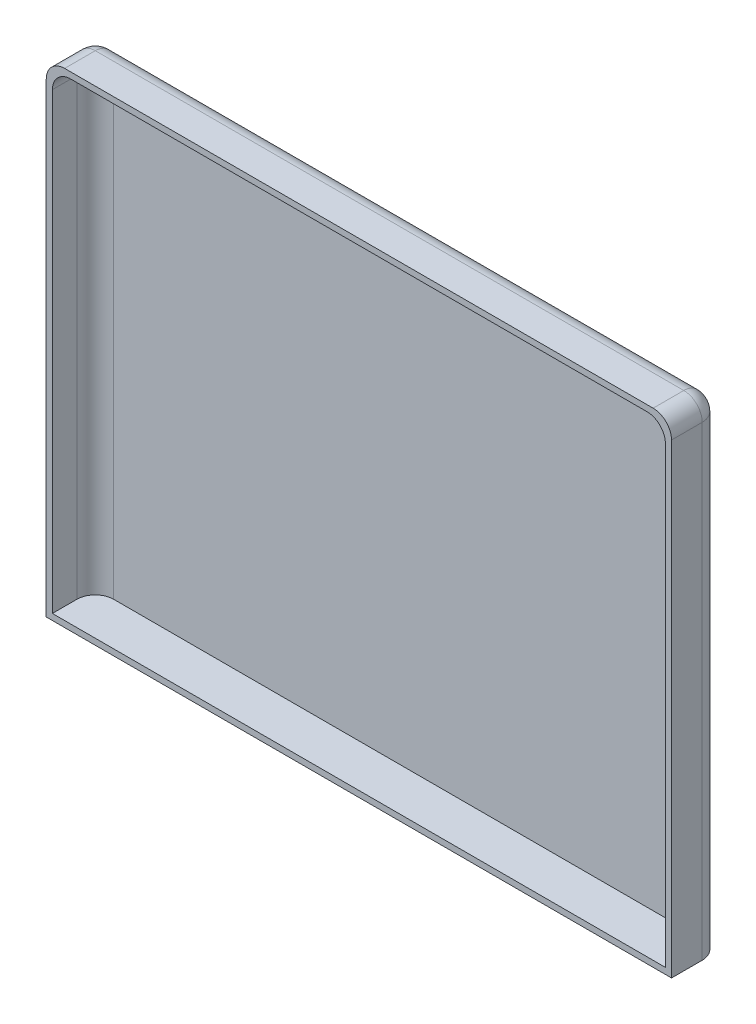
ISO-10303-21;
HEADER;
FILE_DESCRIPTION(('STEP AP214'),'2;1');
FILE_NAME('part.step','',(''),(''),'','','');
FILE_SCHEMA(('AUTOMOTIVE_DESIGN { 1 0 10303 214 1 1 1 1 }'));
ENDSEC;
DATA;
#1=APPLICATION_CONTEXT('core data for automotive mechanical design processes');
#2=APPLICATION_PROTOCOL_DEFINITION('international standard','automotive_design',2000,#1);
#3=PRODUCT_CONTEXT('',#1,'mechanical');
#4=PRODUCT('Part','Part','',(#3));
#5=PRODUCT_RELATED_PRODUCT_CATEGORY('part','',(#4));
#6=PRODUCT_DEFINITION_FORMATION('','',#4);
#7=PRODUCT_DEFINITION_CONTEXT('part definition',#1,'design');
#8=PRODUCT_DEFINITION('design','',#6,#7);
#9=PRODUCT_DEFINITION_SHAPE('','',#8);
#10=(LENGTH_UNIT() NAMED_UNIT(*) SI_UNIT(.MILLI.,.METRE.));
#11=(NAMED_UNIT(*) PLANE_ANGLE_UNIT() SI_UNIT($,.RADIAN.));
#12=(NAMED_UNIT(*) SI_UNIT($,.STERADIAN.) SOLID_ANGLE_UNIT());
#13=UNCERTAINTY_MEASURE_WITH_UNIT(LENGTH_MEASURE(1.E-05),#10,'distance_accuracy_value','');
#14=(GEOMETRIC_REPRESENTATION_CONTEXT(3) GLOBAL_UNCERTAINTY_ASSIGNED_CONTEXT((#13)) GLOBAL_UNIT_ASSIGNED_CONTEXT((#10,
#11,#12)) REPRESENTATION_CONTEXT('',''));
#15=CARTESIAN_POINT('',(0.,0.,0.));
#16=DIRECTION('',(0.,0.,1.));
#17=DIRECTION('',(1.,0.,0.));
#18=AXIS2_PLACEMENT_3D('',#15,#16,#17);
#19=CARTESIAN_POINT('',(0.,0.,-3.));
#20=DIRECTION('',(0.,0.,-1.));
#21=DIRECTION('',(-1.,0.,0.));
#22=AXIS2_PLACEMENT_3D('',#19,#20,#21);
#23=PLANE('',#22);
#24=DIRECTION('',(-1.,0.,0.));
#25=VECTOR('',#24,1.);
#26=CARTESIAN_POINT('',(-4.99999999999999,-5.,-3.));
#27=LINE('',#26,#25);
#28=CARTESIAN_POINT('',(95.,-5.,-3.));
#29=VERTEX_POINT('',#28);
#30=CARTESIAN_POINT('',(-4.99999999999999,-5.,-3.));
#31=VERTEX_POINT('',#30);
#32=EDGE_CURVE('E266',#29,#31,#27,.T.);
#33=ORIENTED_EDGE('',*,*,#32,.T.);
#34=DIRECTION('',(0.,1.,0.));
#35=VECTOR('',#34,1.);
#36=CARTESIAN_POINT('',(-5.,72.,-3.));
#37=LINE('',#36,#35);
#38=CARTESIAN_POINT('',(-5.,69.,-3.));
#39=VERTEX_POINT('',#38);
#40=EDGE_CURVE('E263',#31,#39,#37,.T.);
#41=ORIENTED_EDGE('',*,*,#40,.T.);
#42=CARTESIAN_POINT('',(-2.,69.,-3.));
#43=DIRECTION('',(0.,0.,-1.));
#44=DIRECTION('',(-1.,0.,0.));
#45=AXIS2_PLACEMENT_3D('',#42,#43,#44);
#46=CIRCLE('',#45,3.);
#47=CARTESIAN_POINT('',(-2.,72.,-3.));
#48=VERTEX_POINT('',#47);
#49=EDGE_CURVE('E243',#48,#39,#46,.F.);
#50=ORIENTED_EDGE('',*,*,#49,.F.);
#51=DIRECTION('',(1.,0.,0.));
#52=VECTOR('',#51,1.);
#53=CARTESIAN_POINT('',(-5.,72.,-3.));
#54=LINE('',#53,#52);
#55=CARTESIAN_POINT('',(92.,72.,-3.));
#56=VERTEX_POINT('',#55);
#57=EDGE_CURVE('E267',#48,#56,#54,.T.);
#58=ORIENTED_EDGE('',*,*,#57,.T.);
#59=CARTESIAN_POINT('',(92.,69.,-3.));
#60=DIRECTION('',(0.,0.,-1.));
#61=DIRECTION('',(-1.,0.,0.));
#62=AXIS2_PLACEMENT_3D('',#59,#60,#61);
#63=CIRCLE('',#62,3.);
#64=CARTESIAN_POINT('',(95.,69.,-3.));
#65=VERTEX_POINT('',#64);
#66=EDGE_CURVE('E262',#65,#56,#63,.F.);
#67=ORIENTED_EDGE('',*,*,#66,.F.);
#68=DIRECTION('',(0.,-1.,0.));
#69=VECTOR('',#68,1.);
#70=CARTESIAN_POINT('',(95.,72.,-3.));
#71=LINE('',#70,#69);
#72=EDGE_CURVE('E273',#65,#29,#71,.T.);
#73=ORIENTED_EDGE('',*,*,#72,.T.);
#74=EDGE_LOOP('',(#33,#41,#50,#58,#67,#73));
#75=FACE_BOUND('',#74,.T.);
#76=DIRECTION('',(0.,-1.,0.));
#77=VECTOR('',#76,1.);
#78=CARTESIAN_POINT('',(96.,72.,-3.));
#79=LINE('',#78,#77);
#80=CARTESIAN_POINT('',(96.,70.,-3.));
#81=VERTEX_POINT('',#80);
#82=CARTESIAN_POINT('',(96.,-6.00000000000001,-3.));
#83=VERTEX_POINT('',#82);
#84=EDGE_CURVE('E272',#81,#83,#79,.T.);
#85=ORIENTED_EDGE('',*,*,#84,.F.);
#86=CARTESIAN_POINT('',(93.,70.,-3.));
#87=DIRECTION('',(0.,0.,-1.));
#88=DIRECTION('',(-1.,0.,0.));
#89=AXIS2_PLACEMENT_3D('',#86,#87,#88);
#90=CIRCLE('',#89,3.);
#91=CARTESIAN_POINT('',(93.,73.,-3.));
#92=VERTEX_POINT('',#91);
#93=EDGE_CURVE('E45',#81,#92,#90,.F.);
#94=ORIENTED_EDGE('',*,*,#93,.T.);
#95=DIRECTION('',(1.,0.,0.));
#96=VECTOR('',#95,1.);
#97=CARTESIAN_POINT('',(-5.,73.,-3.));
#98=LINE('',#97,#96);
#99=CARTESIAN_POINT('',(-3.,73.,-3.));
#100=VERTEX_POINT('',#99);
#101=EDGE_CURVE('E270',#100,#92,#98,.T.);
#102=ORIENTED_EDGE('',*,*,#101,.F.);
#103=CARTESIAN_POINT('',(-3.,70.,-3.));
#104=DIRECTION('',(0.,0.,-1.));
#105=DIRECTION('',(-1.,0.,0.));
#106=AXIS2_PLACEMENT_3D('',#103,#104,#105);
#107=CIRCLE('',#106,3.);
#108=CARTESIAN_POINT('',(-6.,70.,-3.));
#109=VERTEX_POINT('',#108);
#110=EDGE_CURVE('E11',#100,#109,#107,.F.);
#111=ORIENTED_EDGE('',*,*,#110,.T.);
#112=DIRECTION('',(0.,1.,0.));
#113=VECTOR('',#112,1.);
#114=CARTESIAN_POINT('',(-6.,72.,-3.));
#115=LINE('',#114,#113);
#116=CARTESIAN_POINT('',(-5.99999999999999,-6.,-3.));
#117=VERTEX_POINT('',#116);
#118=EDGE_CURVE('E59',#117,#109,#115,.T.);
#119=ORIENTED_EDGE('',*,*,#118,.F.);
#120=DIRECTION('',(-1.,0.,0.));
#121=VECTOR('',#120,1.);
#122=CARTESIAN_POINT('',(-4.99999999999999,-6.,-3.));
#123=LINE('',#122,#121);
#124=EDGE_CURVE('E40',#83,#117,#123,.T.);
#125=ORIENTED_EDGE('',*,*,#124,.F.);
#126=EDGE_LOOP('',(#85,#94,#102,#111,#119,#125));
#127=FACE_BOUND('',#126,.T.);
#128=ADVANCED_FACE('F37',(#75,#127),#23,.F.);
#129=CARTESIAN_POINT('',(0.,69.,-7.));
#130=DIRECTION('',(1.,0.,0.));
#131=DIRECTION('',(0.,0.,-1.));
#132=AXIS2_PLACEMENT_3D('',#129,#130,#131);
#133=CYLINDRICAL_SURFACE('',#132,3.);
#134=CARTESIAN_POINT('',(92.,69.,-7.));
#135=DIRECTION('',(-1.,0.,0.));
#136=DIRECTION('',(0.,0.,1.));
#137=AXIS2_PLACEMENT_3D('',#134,#135,#136);
#138=CIRCLE('',#137,3.);
#139=CARTESIAN_POINT('',(92.,69.,-10.));
#140=VERTEX_POINT('',#139);
#141=CARTESIAN_POINT('',(92.,72.,-7.));
#142=VERTEX_POINT('',#141);
#143=EDGE_CURVE('E253',#140,#142,#138,.F.);
#144=ORIENTED_EDGE('',*,*,#143,.T.);
#145=DIRECTION('',(-1.,0.,0.));
#146=VECTOR('',#145,1.);
#147=CARTESIAN_POINT('',(95.,72.,-7.));
#148=LINE('',#147,#146);
#149=CARTESIAN_POINT('',(-2.,72.,-7.));
#150=VERTEX_POINT('',#149);
#151=EDGE_CURVE('E225',#150,#142,#148,.F.);
#152=ORIENTED_EDGE('',*,*,#151,.F.);
#153=CARTESIAN_POINT('',(-2.,69.,-7.));
#154=DIRECTION('',(1.,0.,0.));
#155=DIRECTION('',(0.,0.,-1.));
#156=AXIS2_PLACEMENT_3D('',#153,#154,#155);
#157=CIRCLE('',#156,3.);
#158=CARTESIAN_POINT('',(-2.,69.,-10.));
#159=VERTEX_POINT('',#158);
#160=EDGE_CURVE('E250',#159,#150,#157,.T.);
#161=ORIENTED_EDGE('',*,*,#160,.F.);
#162=DIRECTION('',(-1.,0.,0.));
#163=VECTOR('',#162,1.);
#164=CARTESIAN_POINT('',(-5.,69.,-10.));
#165=LINE('',#164,#163);
#166=EDGE_CURVE('E237',#140,#159,#165,.T.);
#167=ORIENTED_EDGE('',*,*,#166,.F.);
#168=EDGE_LOOP('',(#144,#152,#161,#167));
#169=FACE_BOUND('',#168,.T.);
#170=ADVANCED_FACE('F315',(#169),#133,.F.);
#171=CARTESIAN_POINT('',(-1.99999999999999,0.,-7.));
#172=DIRECTION('',(0.,1.,0.));
#173=DIRECTION('',(-1.,0.,0.));
#174=AXIS2_PLACEMENT_3D('',#171,#172,#173);
#175=CYLINDRICAL_SURFACE('',#174,3.);
#176=CARTESIAN_POINT('',(-1.99999999999999,-5.,-7.));
#177=DIRECTION('',(0.,1.,0.));
#178=DIRECTION('',(0.,0.,1.));
#179=AXIS2_PLACEMENT_3D('',#176,#177,#178);
#180=CIRCLE('',#179,3.);
#181=CARTESIAN_POINT('',(-1.99999999999999,-5.,-10.));
#182=VERTEX_POINT('',#181);
#183=CARTESIAN_POINT('',(-4.99999999999999,-5.,-7.));
#184=VERTEX_POINT('',#183);
#185=EDGE_CURVE('E232',#182,#184,#180,.T.);
#186=ORIENTED_EDGE('',*,*,#185,.F.);
#187=DIRECTION('',(0.,-1.,0.));
#188=VECTOR('',#187,1.);
#189=CARTESIAN_POINT('',(-1.99999999999999,-5.,-10.));
#190=LINE('',#189,#188);
#191=EDGE_CURVE('E239',#159,#182,#190,.T.);
#192=ORIENTED_EDGE('',*,*,#191,.F.);
#193=CARTESIAN_POINT('',(-2.,69.,-7.));
#194=DIRECTION('',(0.,-1.,0.));
#195=DIRECTION('',(0.,0.,-1.));
#196=AXIS2_PLACEMENT_3D('',#193,#194,#195);
#197=CIRCLE('',#196,3.);
#198=CARTESIAN_POINT('',(-5.,69.,-7.));
#199=VERTEX_POINT('',#198);
#200=EDGE_CURVE('E247',#199,#159,#197,.T.);
#201=ORIENTED_EDGE('',*,*,#200,.F.);
#202=DIRECTION('',(0.,-1.,0.));
#203=VECTOR('',#202,1.);
#204=CARTESIAN_POINT('',(-5.,72.,-7.));
#205=LINE('',#204,#203);
#206=EDGE_CURVE('E196',#184,#199,#205,.F.);
#207=ORIENTED_EDGE('',*,*,#206,.F.);
#208=EDGE_LOOP('',(#186,#192,#201,#207));
#209=FACE_BOUND('',#208,.T.);
#210=ADVANCED_FACE('F318',(#209),#175,.F.);
#211=CARTESIAN_POINT('',(0.,0.,-10.));
#212=DIRECTION('',(0.,0.,1.));
#213=DIRECTION('',(1.,0.,0.));
#214=AXIS2_PLACEMENT_3D('',#211,#212,#213);
#215=PLANE('',#214);
#216=DIRECTION('',(1.,0.,0.));
#217=VECTOR('',#216,1.);
#218=CARTESIAN_POINT('',(-4.99999999999999,-5.,-10.));
#219=LINE('',#218,#217);
#220=CARTESIAN_POINT('',(92.,-5.,-10.));
#221=VERTEX_POINT('',#220);
#222=EDGE_CURVE('E157',#182,#221,#219,.T.);
#223=ORIENTED_EDGE('',*,*,#222,.T.);
#224=DIRECTION('',(0.,1.,0.));
#225=VECTOR('',#224,1.);
#226=CARTESIAN_POINT('',(92.,72.,-10.));
#227=LINE('',#226,#225);
#228=EDGE_CURVE('E241',#221,#140,#227,.T.);
#229=ORIENTED_EDGE('',*,*,#228,.T.);
#230=ORIENTED_EDGE('',*,*,#166,.T.);
#231=ORIENTED_EDGE('',*,*,#191,.T.);
#232=EDGE_LOOP('',(#223,#229,#230,#231));
#233=FACE_BOUND('',#232,.T.);
#234=ADVANCED_FACE('F297',(#233),#215,.T.);
#235=CARTESIAN_POINT('',(-4.99999999999999,-5.,8.));
#236=DIRECTION('',(0.,1.,0.));
#237=DIRECTION('',(0.,0.,1.));
#238=AXIS2_PLACEMENT_3D('',#235,#236,#237);
#239=PLANE('',#238);
#240=ORIENTED_EDGE('',*,*,#32,.F.);
#241=DIRECTION('',(0.,0.,-1.));
#242=VECTOR('',#241,1.);
#243=CARTESIAN_POINT('',(95.,-5.,8.));
#244=LINE('',#243,#242);
#245=CARTESIAN_POINT('',(95.,-5.,-7.));
#246=VERTEX_POINT('',#245);
#247=EDGE_CURVE('E176',#29,#246,#244,.T.);
#248=ORIENTED_EDGE('',*,*,#247,.T.);
#249=CARTESIAN_POINT('',(92.,-5.,-7.));
#250=DIRECTION('',(0.,1.,0.));
#251=DIRECTION('',(0.,0.,1.));
#252=AXIS2_PLACEMENT_3D('',#249,#250,#251);
#253=CIRCLE('',#252,3.);
#254=EDGE_CURVE('E235',#246,#221,#253,.T.);
#255=ORIENTED_EDGE('',*,*,#254,.T.);
#256=ORIENTED_EDGE('',*,*,#222,.F.);
#257=ORIENTED_EDGE('',*,*,#185,.T.);
#258=DIRECTION('',(0.,0.,-1.));
#259=VECTOR('',#258,1.);
#260=CARTESIAN_POINT('',(-4.99999999999999,-5.,8.));
#261=LINE('',#260,#259);
#262=EDGE_CURVE('E292',#31,#184,#261,.T.);
#263=ORIENTED_EDGE('',*,*,#262,.F.);
#264=EDGE_LOOP('',(#240,#248,#255,#256,#257,#263));
#265=FACE_BOUND('',#264,.T.);
#266=ADVANCED_FACE('F323',(#265),#239,.T.);
#267=CARTESIAN_POINT('',(92.,0.,-7.));
#268=DIRECTION('',(0.,-1.,0.));
#269=DIRECTION('',(1.,0.,0.));
#270=AXIS2_PLACEMENT_3D('',#267,#268,#269);
#271=CYLINDRICAL_SURFACE('',#270,3.);
#272=CARTESIAN_POINT('',(92.,69.,-7.));
#273=DIRECTION('',(0.,-1.,0.));
#274=DIRECTION('',(0.,0.,-1.));
#275=AXIS2_PLACEMENT_3D('',#272,#273,#274);
#276=CIRCLE('',#275,3.);
#277=CARTESIAN_POINT('',(95.,69.,-7.));
#278=VERTEX_POINT('',#277);
#279=EDGE_CURVE('E200',#140,#278,#276,.T.);
#280=ORIENTED_EDGE('',*,*,#279,.F.);
#281=ORIENTED_EDGE('',*,*,#228,.F.);
#282=ORIENTED_EDGE('',*,*,#254,.F.);
#283=DIRECTION('',(0.,1.,0.));
#284=VECTOR('',#283,1.);
#285=CARTESIAN_POINT('',(95.,-5.,-7.));
#286=LINE('',#285,#284);
#287=EDGE_CURVE('E222',#278,#246,#286,.F.);
#288=ORIENTED_EDGE('',*,*,#287,.F.);
#289=EDGE_LOOP('',(#280,#281,#282,#288));
#290=FACE_BOUND('',#289,.T.);
#291=ADVANCED_FACE('F304',(#290),#271,.F.);
#292=CARTESIAN_POINT('',(92.,69.,-7.));
#293=DIRECTION('',(0.,0.,1.));
#294=DIRECTION('',(1.,0.,0.));
#295=AXIS2_PLACEMENT_3D('',#292,#293,#294);
#296=SPHERICAL_SURFACE('',#295,3.);
#297=ORIENTED_EDGE('',*,*,#143,.F.);
#298=ORIENTED_EDGE('',*,*,#279,.T.);
#299=CARTESIAN_POINT('',(92.,69.,-7.));
#300=DIRECTION('',(0.,0.,1.));
#301=DIRECTION('',(1.,0.,0.));
#302=AXIS2_PLACEMENT_3D('',#299,#300,#301);
#303=CIRCLE('',#302,3.);
#304=EDGE_CURVE('E256',#142,#278,#303,.F.);
#305=ORIENTED_EDGE('',*,*,#304,.F.);
#306=EDGE_LOOP('',(#297,#298,#305));
#307=FACE_BOUND('',#306,.T.);
#308=ADVANCED_FACE('F310',(#307),#296,.F.);
#309=CARTESIAN_POINT('',(-2.,69.,-7.));
#310=DIRECTION('',(0.,0.,1.));
#311=DIRECTION('',(1.,0.,0.));
#312=AXIS2_PLACEMENT_3D('',#309,#310,#311);
#313=SPHERICAL_SURFACE('',#312,3.);
#314=ORIENTED_EDGE('',*,*,#200,.T.);
#315=ORIENTED_EDGE('',*,*,#160,.T.);
#316=CARTESIAN_POINT('',(-2.,69.,-7.));
#317=DIRECTION('',(0.,0.,1.));
#318=DIRECTION('',(1.,0.,0.));
#319=AXIS2_PLACEMENT_3D('',#316,#317,#318);
#320=CIRCLE('',#319,3.);
#321=EDGE_CURVE('E244',#199,#150,#320,.F.);
#322=ORIENTED_EDGE('',*,*,#321,.F.);
#323=EDGE_LOOP('',(#314,#315,#322));
#324=FACE_BOUND('',#323,.T.);
#325=ADVANCED_FACE('F342',(#324),#313,.F.);
#326=CARTESIAN_POINT('',(-5.,72.,8.));
#327=DIRECTION('',(1.,0.,0.));
#328=DIRECTION('',(0.,1.,0.));
#329=AXIS2_PLACEMENT_3D('',#326,#327,#328);
#330=PLANE('',#329);
#331=ORIENTED_EDGE('',*,*,#40,.F.);
#332=ORIENTED_EDGE('',*,*,#262,.T.);
#333=ORIENTED_EDGE('',*,*,#206,.T.);
#334=DIRECTION('',(0.,0.,-1.));
#335=VECTOR('',#334,1.);
#336=CARTESIAN_POINT('',(-5.,69.,4.5));
#337=LINE('',#336,#335);
#338=EDGE_CURVE('E217',#199,#39,#337,.F.);
#339=ORIENTED_EDGE('',*,*,#338,.T.);
#340=EDGE_LOOP('',(#331,#332,#333,#339));
#341=FACE_BOUND('',#340,.T.);
#342=ADVANCED_FACE('F326',(#341),#330,.T.);
#343=CARTESIAN_POINT('',(-5.,72.,8.));
#344=DIRECTION('',(0.,-1.,0.));
#345=DIRECTION('',(0.,0.,-1.));
#346=AXIS2_PLACEMENT_3D('',#343,#344,#345);
#347=PLANE('',#346);
#348=ORIENTED_EDGE('',*,*,#57,.F.);
#349=DIRECTION('',(0.,0.,-1.));
#350=VECTOR('',#349,1.);
#351=CARTESIAN_POINT('',(-2.,72.,-10.));
#352=LINE('',#351,#350);
#353=EDGE_CURVE('E230',#48,#150,#352,.T.);
#354=ORIENTED_EDGE('',*,*,#353,.T.);
#355=ORIENTED_EDGE('',*,*,#151,.T.);
#356=DIRECTION('',(0.,0.,-1.));
#357=VECTOR('',#356,1.);
#358=CARTESIAN_POINT('',(92.,72.,4.5));
#359=LINE('',#358,#357);
#360=EDGE_CURVE('E227',#142,#56,#359,.F.);
#361=ORIENTED_EDGE('',*,*,#360,.T.);
#362=EDGE_LOOP('',(#348,#354,#355,#361));
#363=FACE_BOUND('',#362,.T.);
#364=ADVANCED_FACE('F337',(#363),#347,.T.);
#365=CARTESIAN_POINT('',(-2.,69.,8.));
#366=DIRECTION('',(0.,0.,1.));
#367=DIRECTION('',(1.,0.,0.));
#368=AXIS2_PLACEMENT_3D('',#365,#366,#367);
#369=CYLINDRICAL_SURFACE('',#368,3.);
#370=ORIENTED_EDGE('',*,*,#353,.F.);
#371=ORIENTED_EDGE('',*,*,#49,.T.);
#372=ORIENTED_EDGE('',*,*,#338,.F.);
#373=ORIENTED_EDGE('',*,*,#321,.T.);
#374=EDGE_LOOP('',(#370,#371,#372,#373));
#375=FACE_BOUND('',#374,.T.);
#376=ADVANCED_FACE('F340',(#375),#369,.F.);
#377=CARTESIAN_POINT('',(95.,72.,8.));
#378=DIRECTION('',(-1.,0.,0.));
#379=DIRECTION('',(0.,-1.,0.));
#380=AXIS2_PLACEMENT_3D('',#377,#378,#379);
#381=PLANE('',#380);
#382=ORIENTED_EDGE('',*,*,#72,.F.);
#383=DIRECTION('',(0.,0.,-1.));
#384=VECTOR('',#383,1.);
#385=CARTESIAN_POINT('',(95.,69.,-10.));
#386=LINE('',#385,#384);
#387=EDGE_CURVE('E220',#65,#278,#386,.T.);
#388=ORIENTED_EDGE('',*,*,#387,.T.);
#389=ORIENTED_EDGE('',*,*,#287,.T.);
#390=ORIENTED_EDGE('',*,*,#247,.F.);
#391=EDGE_LOOP('',(#382,#388,#389,#390));
#392=FACE_BOUND('',#391,.T.);
#393=ADVANCED_FACE('F333',(#392),#381,.T.);
#394=CARTESIAN_POINT('',(92.,69.,8.));
#395=DIRECTION('',(0.,0.,1.));
#396=DIRECTION('',(1.,0.,0.));
#397=AXIS2_PLACEMENT_3D('',#394,#395,#396);
#398=CYLINDRICAL_SURFACE('',#397,3.);
#399=ORIENTED_EDGE('',*,*,#387,.F.);
#400=ORIENTED_EDGE('',*,*,#66,.T.);
#401=ORIENTED_EDGE('',*,*,#360,.F.);
#402=ORIENTED_EDGE('',*,*,#304,.T.);
#403=EDGE_LOOP('',(#399,#400,#401,#402));
#404=FACE_BOUND('',#403,.T.);
#405=ADVANCED_FACE('F335',(#404),#398,.F.);
#406=CARTESIAN_POINT('',(-5.,73.,8.));
#407=DIRECTION('',(0.,-1.,0.));
#408=DIRECTION('',(0.,0.,-1.));
#409=AXIS2_PLACEMENT_3D('',#406,#407,#408);
#410=PLANE('',#409);
#411=DIRECTION('',(0.,0.,-1.));
#412=VECTOR('',#411,1.);
#413=CARTESIAN_POINT('',(-3.,73.,8.));
#414=LINE('',#413,#412);
#415=CARTESIAN_POINT('',(-3.,73.,-8.));
#416=VERTEX_POINT('',#415);
#417=EDGE_CURVE('E188',#416,#100,#414,.F.);
#418=ORIENTED_EDGE('',*,*,#417,.T.);
#419=ORIENTED_EDGE('',*,*,#101,.T.);
#420=DIRECTION('',(0.,0.,-1.));
#421=VECTOR('',#420,1.);
#422=CARTESIAN_POINT('',(93.,73.,8.));
#423=LINE('',#422,#421);
#424=CARTESIAN_POINT('',(93.,73.,-8.));
#425=VERTEX_POINT('',#424);
#426=EDGE_CURVE('E184',#92,#425,#423,.T.);
#427=ORIENTED_EDGE('',*,*,#426,.T.);
#428=DIRECTION('',(-1.,0.,0.));
#429=VECTOR('',#428,1.);
#430=CARTESIAN_POINT('',(-5.,73.,-8.));
#431=LINE('',#430,#429);
#432=EDGE_CURVE('E186',#425,#416,#431,.T.);
#433=ORIENTED_EDGE('',*,*,#432,.T.);
#434=EDGE_LOOP('',(#418,#419,#427,#433));
#435=FACE_BOUND('',#434,.T.);
#436=ADVANCED_FACE('F413',(#435),#410,.F.);
#437=CARTESIAN_POINT('',(-6.,72.,8.));
#438=DIRECTION('',(1.,0.,0.));
#439=DIRECTION('',(0.,1.,0.));
#440=AXIS2_PLACEMENT_3D('',#437,#438,#439);
#441=PLANE('',#440);
#442=DIRECTION('',(0.,0.,-1.));
#443=VECTOR('',#442,1.);
#444=CARTESIAN_POINT('',(-5.99999999999999,-6.,8.));
#445=LINE('',#444,#443);
#446=CARTESIAN_POINT('',(-5.99999999999999,-6.,-8.));
#447=VERTEX_POINT('',#446);
#448=EDGE_CURVE('E149',#117,#447,#445,.T.);
#449=ORIENTED_EDGE('',*,*,#448,.F.);
#450=ORIENTED_EDGE('',*,*,#118,.T.);
#451=DIRECTION('',(0.,0.,-1.));
#452=VECTOR('',#451,1.);
#453=CARTESIAN_POINT('',(-6.,70.,8.));
#454=LINE('',#453,#452);
#455=CARTESIAN_POINT('',(-6.,70.,-8.));
#456=VERTEX_POINT('',#455);
#457=EDGE_CURVE('E171',#109,#456,#454,.T.);
#458=ORIENTED_EDGE('',*,*,#457,.T.);
#459=DIRECTION('',(0.,-1.,0.));
#460=VECTOR('',#459,1.);
#461=CARTESIAN_POINT('',(-6.,72.,-8.));
#462=LINE('',#461,#460);
#463=EDGE_CURVE('E165',#456,#447,#462,.T.);
#464=ORIENTED_EDGE('',*,*,#463,.T.);
#465=EDGE_LOOP('',(#449,#450,#458,#464));
#466=FACE_BOUND('',#465,.T.);
#467=ADVANCED_FACE('F170',(#466),#441,.F.);
#468=CARTESIAN_POINT('',(-4.99999999999999,-6.,8.));
#469=DIRECTION('',(0.,1.,0.));
#470=DIRECTION('',(0.,0.,1.));
#471=AXIS2_PLACEMENT_3D('',#468,#469,#470);
#472=PLANE('',#471);
#473=DIRECTION('',(0.,0.,-1.));
#474=VECTOR('',#473,1.);
#475=CARTESIAN_POINT('',(96.,-6.00000000000001,8.));
#476=LINE('',#475,#474);
#477=CARTESIAN_POINT('',(96.,-6.00000000000001,-8.));
#478=VERTEX_POINT('',#477);
#479=EDGE_CURVE('E158',#83,#478,#476,.T.);
#480=ORIENTED_EDGE('',*,*,#479,.F.);
#481=ORIENTED_EDGE('',*,*,#124,.T.);
#482=ORIENTED_EDGE('',*,*,#448,.T.);
#483=CARTESIAN_POINT('',(-2.99999999999999,-6.00000000000001,-8.));
#484=DIRECTION('',(0.,1.,0.));
#485=DIRECTION('',(0.,0.,1.));
#486=AXIS2_PLACEMENT_3D('',#483,#484,#485);
#487=CIRCLE('',#486,3.);
#488=CARTESIAN_POINT('',(-2.99999999999999,-6.,-11.));
#489=VERTEX_POINT('',#488);
#490=EDGE_CURVE('E154',#447,#489,#487,.F.);
#491=ORIENTED_EDGE('',*,*,#490,.T.);
#492=DIRECTION('',(1.,0.,0.));
#493=VECTOR('',#492,1.);
#494=CARTESIAN_POINT('',(-4.99999999999999,-6.,-11.));
#495=LINE('',#494,#493);
#496=CARTESIAN_POINT('',(93.,-6.,-11.));
#497=VERTEX_POINT('',#496);
#498=EDGE_CURVE('E215',#489,#497,#495,.T.);
#499=ORIENTED_EDGE('',*,*,#498,.T.);
#500=CARTESIAN_POINT('',(93.,-6.00000000000001,-8.));
#501=DIRECTION('',(0.,1.,0.));
#502=DIRECTION('',(0.,0.,1.));
#503=AXIS2_PLACEMENT_3D('',#500,#501,#502);
#504=CIRCLE('',#503,3.);
#505=EDGE_CURVE('E168',#497,#478,#504,.F.);
#506=ORIENTED_EDGE('',*,*,#505,.T.);
#507=EDGE_LOOP('',(#480,#481,#482,#491,#499,#506));
#508=FACE_BOUND('',#507,.T.);
#509=ADVANCED_FACE('F152',(#508),#472,.F.);
#510=CARTESIAN_POINT('',(96.,72.,8.));
#511=DIRECTION('',(-1.,0.,0.));
#512=DIRECTION('',(0.,-1.,0.));
#513=AXIS2_PLACEMENT_3D('',#510,#511,#512);
#514=PLANE('',#513);
#515=DIRECTION('',(0.,0.,-1.));
#516=VECTOR('',#515,1.);
#517=CARTESIAN_POINT('',(96.,70.,8.));
#518=LINE('',#517,#516);
#519=CARTESIAN_POINT('',(96.,70.,-8.));
#520=VERTEX_POINT('',#519);
#521=EDGE_CURVE('E191',#520,#81,#518,.F.);
#522=ORIENTED_EDGE('',*,*,#521,.T.);
#523=ORIENTED_EDGE('',*,*,#84,.T.);
#524=ORIENTED_EDGE('',*,*,#479,.T.);
#525=DIRECTION('',(0.,1.,0.));
#526=VECTOR('',#525,1.);
#527=CARTESIAN_POINT('',(96.,72.,-8.));
#528=LINE('',#527,#526);
#529=EDGE_CURVE('E194',#478,#520,#528,.T.);
#530=ORIENTED_EDGE('',*,*,#529,.T.);
#531=EDGE_LOOP('',(#522,#523,#524,#530));
#532=FACE_BOUND('',#531,.T.);
#533=ADVANCED_FACE('F283',(#532),#514,.F.);
#534=CARTESIAN_POINT('',(0.,0.,-11.));
#535=DIRECTION('',(0.,0.,1.));
#536=DIRECTION('',(1.,0.,0.));
#537=AXIS2_PLACEMENT_3D('',#534,#535,#536);
#538=PLANE('',#537);
#539=ORIENTED_EDGE('',*,*,#498,.F.);
#540=DIRECTION('',(0.,-1.,0.));
#541=VECTOR('',#540,1.);
#542=CARTESIAN_POINT('',(-2.99999999999999,0.,-11.));
#543=LINE('',#542,#541);
#544=CARTESIAN_POINT('',(-3.,70.,-11.));
#545=VERTEX_POINT('',#544);
#546=EDGE_CURVE('E166',#489,#545,#543,.F.);
#547=ORIENTED_EDGE('',*,*,#546,.T.);
#548=DIRECTION('',(-1.,0.,0.));
#549=VECTOR('',#548,1.);
#550=CARTESIAN_POINT('',(0.,70.,-11.));
#551=LINE('',#550,#549);
#552=CARTESIAN_POINT('',(93.,70.,-11.));
#553=VERTEX_POINT('',#552);
#554=EDGE_CURVE('E167',#545,#553,#551,.F.);
#555=ORIENTED_EDGE('',*,*,#554,.T.);
#556=DIRECTION('',(0.,1.,0.));
#557=VECTOR('',#556,1.);
#558=CARTESIAN_POINT('',(93.,0.,-11.));
#559=LINE('',#558,#557);
#560=EDGE_CURVE('E181',#553,#497,#559,.F.);
#561=ORIENTED_EDGE('',*,*,#560,.T.);
#562=EDGE_LOOP('',(#539,#547,#555,#561));
#563=FACE_BOUND('',#562,.T.);
#564=ADVANCED_FACE('F388',(#563),#538,.F.);
#565=CARTESIAN_POINT('',(93.,72.,-8.));
#566=DIRECTION('',(0.,1.,0.));
#567=DIRECTION('',(-1.,0.,0.));
#568=AXIS2_PLACEMENT_3D('',#565,#566,#567);
#569=CYLINDRICAL_SURFACE('',#568,3.);
#570=ORIENTED_EDGE('',*,*,#505,.F.);
#571=ORIENTED_EDGE('',*,*,#560,.F.);
#572=CARTESIAN_POINT('',(93.,70.,-8.));
#573=DIRECTION('',(0.,1.,0.));
#574=DIRECTION('',(0.,0.,1.));
#575=AXIS2_PLACEMENT_3D('',#572,#573,#574);
#576=CIRCLE('',#575,3.);
#577=EDGE_CURVE('E212',#520,#553,#576,.T.);
#578=ORIENTED_EDGE('',*,*,#577,.F.);
#579=ORIENTED_EDGE('',*,*,#529,.F.);
#580=EDGE_LOOP('',(#570,#571,#578,#579));
#581=FACE_BOUND('',#580,.T.);
#582=ADVANCED_FACE('F385',(#581),#569,.T.);
#583=CARTESIAN_POINT('',(93.,70.,8.));
#584=DIRECTION('',(0.,0.,-1.));
#585=DIRECTION('',(-1.,0.,0.));
#586=AXIS2_PLACEMENT_3D('',#583,#584,#585);
#587=CYLINDRICAL_SURFACE('',#586,3.);
#588=ORIENTED_EDGE('',*,*,#93,.F.);
#589=ORIENTED_EDGE('',*,*,#521,.F.);
#590=CARTESIAN_POINT('',(93.,70.,-8.));
#591=DIRECTION('',(0.,0.,-1.));
#592=DIRECTION('',(-1.,0.,0.));
#593=AXIS2_PLACEMENT_3D('',#590,#591,#592);
#594=CIRCLE('',#593,3.);
#595=EDGE_CURVE('E209',#425,#520,#594,.T.);
#596=ORIENTED_EDGE('',*,*,#595,.F.);
#597=ORIENTED_EDGE('',*,*,#426,.F.);
#598=EDGE_LOOP('',(#588,#589,#596,#597));
#599=FACE_BOUND('',#598,.T.);
#600=ADVANCED_FACE('F381',(#599),#587,.T.);
#601=CARTESIAN_POINT('',(93.,70.,-8.));
#602=DIRECTION('',(0.,0.,1.));
#603=DIRECTION('',(1.,0.,0.));
#604=AXIS2_PLACEMENT_3D('',#601,#602,#603);
#605=SPHERICAL_SURFACE('',#604,3.);
#606=ORIENTED_EDGE('',*,*,#595,.T.);
#607=ORIENTED_EDGE('',*,*,#577,.T.);
#608=CARTESIAN_POINT('',(93.,70.,-8.));
#609=DIRECTION('',(1.,0.,0.));
#610=DIRECTION('',(0.,0.,-1.));
#611=AXIS2_PLACEMENT_3D('',#608,#609,#610);
#612=CIRCLE('',#611,3.);
#613=EDGE_CURVE('E206',#425,#553,#612,.F.);
#614=ORIENTED_EDGE('',*,*,#613,.F.);
#615=EDGE_LOOP('',(#606,#607,#614));
#616=FACE_BOUND('',#615,.T.);
#617=ADVANCED_FACE('F377',(#616),#605,.T.);
#618=CARTESIAN_POINT('',(-5.,70.,-8.));
#619=DIRECTION('',(-1.,0.,0.));
#620=DIRECTION('',(0.,0.,1.));
#621=AXIS2_PLACEMENT_3D('',#618,#619,#620);
#622=CYLINDRICAL_SURFACE('',#621,3.);
#623=ORIENTED_EDGE('',*,*,#613,.T.);
#624=ORIENTED_EDGE('',*,*,#554,.F.);
#625=CARTESIAN_POINT('',(-3.,70.,-8.));
#626=DIRECTION('',(-1.,0.,0.));
#627=DIRECTION('',(0.,0.,1.));
#628=AXIS2_PLACEMENT_3D('',#625,#626,#627);
#629=CIRCLE('',#628,3.);
#630=EDGE_CURVE('E203',#416,#545,#629,.T.);
#631=ORIENTED_EDGE('',*,*,#630,.F.);
#632=ORIENTED_EDGE('',*,*,#432,.F.);
#633=EDGE_LOOP('',(#623,#624,#631,#632));
#634=FACE_BOUND('',#633,.T.);
#635=ADVANCED_FACE('F374',(#634),#622,.T.);
#636=CARTESIAN_POINT('',(-3.,70.,8.));
#637=DIRECTION('',(0.,0.,-1.));
#638=DIRECTION('',(-1.,0.,0.));
#639=AXIS2_PLACEMENT_3D('',#636,#637,#638);
#640=CYLINDRICAL_SURFACE('',#639,3.);
#641=ORIENTED_EDGE('',*,*,#110,.F.);
#642=ORIENTED_EDGE('',*,*,#417,.F.);
#643=CARTESIAN_POINT('',(-3.,70.,-8.));
#644=DIRECTION('',(0.,0.,-1.));
#645=DIRECTION('',(-1.,0.,0.));
#646=AXIS2_PLACEMENT_3D('',#643,#644,#645);
#647=CIRCLE('',#646,3.);
#648=EDGE_CURVE('E199',#456,#416,#647,.T.);
#649=ORIENTED_EDGE('',*,*,#648,.F.);
#650=ORIENTED_EDGE('',*,*,#457,.F.);
#651=EDGE_LOOP('',(#641,#642,#649,#650));
#652=FACE_BOUND('',#651,.T.);
#653=ADVANCED_FACE('F366',(#652),#640,.T.);
#654=CARTESIAN_POINT('',(-3.,70.,-8.));
#655=DIRECTION('',(0.,0.,1.));
#656=DIRECTION('',(1.,0.,0.));
#657=AXIS2_PLACEMENT_3D('',#654,#655,#656);
#658=SPHERICAL_SURFACE('',#657,3.);
#659=ORIENTED_EDGE('',*,*,#648,.T.);
#660=ORIENTED_EDGE('',*,*,#630,.T.);
#661=CARTESIAN_POINT('',(-3.,70.,-8.));
#662=DIRECTION('',(0.,1.,0.));
#663=DIRECTION('',(0.,0.,1.));
#664=AXIS2_PLACEMENT_3D('',#661,#662,#663);
#665=CIRCLE('',#664,3.);
#666=EDGE_CURVE('E197',#456,#545,#665,.F.);
#667=ORIENTED_EDGE('',*,*,#666,.F.);
#668=EDGE_LOOP('',(#659,#660,#667));
#669=FACE_BOUND('',#668,.T.);
#670=ADVANCED_FACE('F361',(#669),#658,.T.);
#671=CARTESIAN_POINT('',(-3.,72.,-8.));
#672=DIRECTION('',(0.,-1.,0.));
#673=DIRECTION('',(1.,0.,0.));
#674=AXIS2_PLACEMENT_3D('',#671,#672,#673);
#675=CYLINDRICAL_SURFACE('',#674,3.);
#676=ORIENTED_EDGE('',*,*,#666,.T.);
#677=ORIENTED_EDGE('',*,*,#546,.F.);
#678=ORIENTED_EDGE('',*,*,#490,.F.);
#679=ORIENTED_EDGE('',*,*,#463,.F.);
#680=EDGE_LOOP('',(#676,#677,#678,#679));
#681=FACE_BOUND('',#680,.T.);
#682=ADVANCED_FACE('F164',(#681),#675,.T.);
#683=CLOSED_SHELL('',(#128,#170,#210,#234,#266,#291,#308,#325,#342,#364,#376,#393,#405,#436,
#467,#509,#533,#564,#582,#600,#617,#635,#653,#670,#682));
#684=MANIFOLD_SOLID_BREP('B2',#683);
#685=ADVANCED_BREP_SHAPE_REPRESENTATION('',(#18,#684),#14);
#686=SHAPE_DEFINITION_REPRESENTATION(#9,#685);
ENDSEC;
END-ISO-10303-21;
